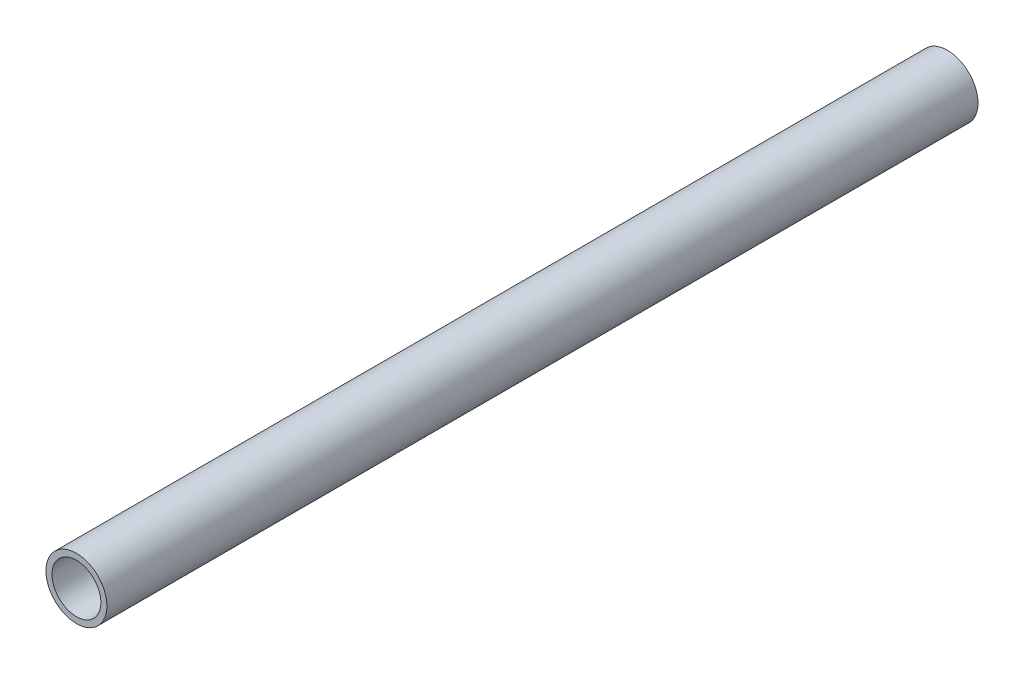
ISO-10303-21;
HEADER;
FILE_DESCRIPTION(('STEP AP214'),'2;1');
FILE_NAME('part.step','',(''),(''),'','','');
FILE_SCHEMA(('AUTOMOTIVE_DESIGN { 1 0 10303 214 1 1 1 1 }'));
ENDSEC;
DATA;
#1=APPLICATION_CONTEXT('core data for automotive mechanical design processes');
#2=APPLICATION_PROTOCOL_DEFINITION('international standard','automotive_design',2000,#1);
#3=PRODUCT_CONTEXT('',#1,'mechanical');
#4=PRODUCT('Part','Part','',(#3));
#5=PRODUCT_RELATED_PRODUCT_CATEGORY('part','',(#4));
#6=PRODUCT_DEFINITION_FORMATION('','',#4);
#7=PRODUCT_DEFINITION_CONTEXT('part definition',#1,'design');
#8=PRODUCT_DEFINITION('design','',#6,#7);
#9=PRODUCT_DEFINITION_SHAPE('','',#8);
#10=(LENGTH_UNIT() NAMED_UNIT(*) SI_UNIT(.MILLI.,.METRE.));
#11=(NAMED_UNIT(*) PLANE_ANGLE_UNIT() SI_UNIT($,.RADIAN.));
#12=(NAMED_UNIT(*) SI_UNIT($,.STERADIAN.) SOLID_ANGLE_UNIT());
#13=UNCERTAINTY_MEASURE_WITH_UNIT(LENGTH_MEASURE(1.E-05),#10,'distance_accuracy_value','');
#14=(GEOMETRIC_REPRESENTATION_CONTEXT(3) GLOBAL_UNCERTAINTY_ASSIGNED_CONTEXT((#13)) GLOBAL_UNIT_ASSIGNED_CONTEXT((#10,
#11,#12)) REPRESENTATION_CONTEXT('',''));
#15=CARTESIAN_POINT('',(0.,0.,0.));
#16=DIRECTION('',(0.,0.,1.));
#17=DIRECTION('',(1.,0.,0.));
#18=AXIS2_PLACEMENT_3D('',#15,#16,#17);
#19=CARTESIAN_POINT('',(0.,0.,152.4));
#20=DIRECTION('',(0.,0.,1.));
#21=DIRECTION('',(1.,0.,0.));
#22=AXIS2_PLACEMENT_3D('',#19,#20,#21);
#23=PLANE('',#22);
#24=CARTESIAN_POINT('',(0.,0.,152.4));
#25=DIRECTION('',(0.,0.,1.));
#26=DIRECTION('',(1.,0.,0.));
#27=AXIS2_PLACEMENT_3D('',#24,#25,#26);
#28=CIRCLE('',#27,10.668);
#29=CARTESIAN_POINT('',(10.668,0.,152.4));
#30=VERTEX_POINT('',#29);
#31=EDGE_CURVE('E10',#30,#30,#28,.T.);
#32=ORIENTED_EDGE('',*,*,#31,.T.);
#33=EDGE_LOOP('',(#32));
#34=FACE_BOUND('',#33,.T.);
#35=CARTESIAN_POINT('',(0.,0.,152.4));
#36=DIRECTION('',(0.,0.,1.));
#37=DIRECTION('',(1.,0.,0.));
#38=AXIS2_PLACEMENT_3D('',#35,#36,#37);
#39=CIRCLE('',#38,8.55980000000001);
#40=CARTESIAN_POINT('',(8.55980000000001,0.,152.4));
#41=VERTEX_POINT('',#40);
#42=EDGE_CURVE('E37',#41,#41,#39,.T.);
#43=ORIENTED_EDGE('',*,*,#42,.F.);
#44=EDGE_LOOP('',(#43));
#45=FACE_BOUND('',#44,.T.);
#46=ADVANCED_FACE('F30',(#34,#45),#23,.T.);
#47=CARTESIAN_POINT('',(0.,0.,152.4));
#48=DIRECTION('',(0.,0.,-1.));
#49=DIRECTION('',(-1.,0.,0.));
#50=AXIS2_PLACEMENT_3D('',#47,#48,#49);
#51=CYLINDRICAL_SURFACE('',#50,10.668);
#52=ORIENTED_EDGE('',*,*,#31,.F.);
#53=EDGE_LOOP('',(#52));
#54=FACE_BOUND('',#53,.T.);
#55=CARTESIAN_POINT('',(0.,0.,-152.4));
#56=DIRECTION('',(0.,0.,1.));
#57=DIRECTION('',(1.,0.,0.));
#58=AXIS2_PLACEMENT_3D('',#55,#56,#57);
#59=CIRCLE('',#58,10.668);
#60=CARTESIAN_POINT('',(10.668,0.,-152.4));
#61=VERTEX_POINT('',#60);
#62=EDGE_CURVE('E41',#61,#61,#59,.T.);
#63=ORIENTED_EDGE('',*,*,#62,.T.);
#64=EDGE_LOOP('',(#63));
#65=FACE_BOUND('',#64,.T.);
#66=ADVANCED_FACE('F32',(#54,#65),#51,.T.);
#67=CARTESIAN_POINT('',(0.,0.,152.4));
#68=DIRECTION('',(0.,0.,-1.));
#69=DIRECTION('',(-1.,0.,0.));
#70=AXIS2_PLACEMENT_3D('',#67,#68,#69);
#71=CYLINDRICAL_SURFACE('',#70,8.55980000000001);
#72=ORIENTED_EDGE('',*,*,#42,.T.);
#73=EDGE_LOOP('',(#72));
#74=FACE_BOUND('',#73,.T.);
#75=CARTESIAN_POINT('',(0.,0.,-152.4));
#76=DIRECTION('',(0.,0.,1.));
#77=DIRECTION('',(1.,0.,0.));
#78=AXIS2_PLACEMENT_3D('',#75,#76,#77);
#79=CIRCLE('',#78,8.55980000000001);
#80=CARTESIAN_POINT('',(8.55980000000001,0.,-152.4));
#81=VERTEX_POINT('',#80);
#82=EDGE_CURVE('E45',#81,#81,#79,.T.);
#83=ORIENTED_EDGE('',*,*,#82,.F.);
#84=EDGE_LOOP('',(#83));
#85=FACE_BOUND('',#84,.T.);
#86=ADVANCED_FACE('F54',(#74,#85),#71,.F.);
#87=CARTESIAN_POINT('',(0.,0.,-152.4));
#88=DIRECTION('',(0.,0.,1.));
#89=DIRECTION('',(1.,0.,0.));
#90=AXIS2_PLACEMENT_3D('',#87,#88,#89);
#91=PLANE('',#90);
#92=ORIENTED_EDGE('',*,*,#82,.T.);
#93=EDGE_LOOP('',(#92));
#94=FACE_BOUND('',#93,.T.);
#95=ORIENTED_EDGE('',*,*,#62,.F.);
#96=EDGE_LOOP('',(#95));
#97=FACE_BOUND('',#96,.T.);
#98=ADVANCED_FACE('F51',(#94,#97),#91,.F.);
#99=CLOSED_SHELL('',(#46,#66,#86,#98));
#100=MANIFOLD_SOLID_BREP('B2',#99);
#101=ADVANCED_BREP_SHAPE_REPRESENTATION('',(#18,#100),#14);
#102=SHAPE_DEFINITION_REPRESENTATION(#9,#101);
ENDSEC;
END-ISO-10303-21;
